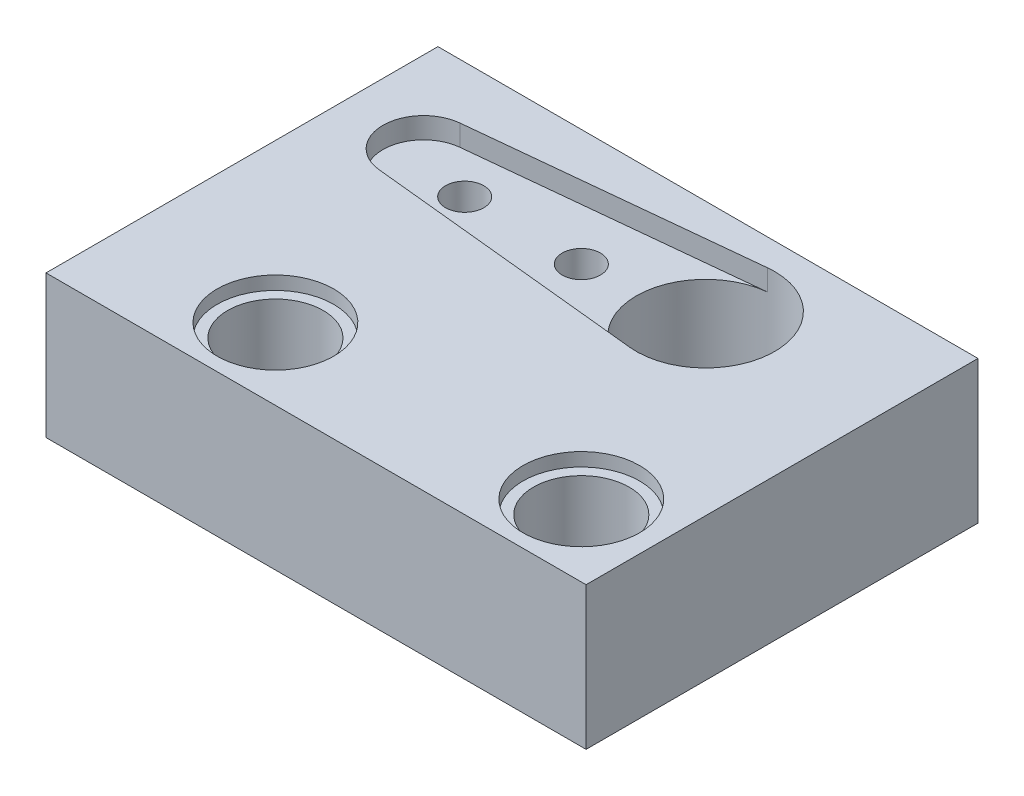
ISO-10303-21;
HEADER;
FILE_DESCRIPTION(('STEP AP214'),'2;1');
FILE_NAME('part.step','',(''),(''),'','','');
FILE_SCHEMA(('AUTOMOTIVE_DESIGN { 1 0 10303 214 1 1 1 1 }'));
ENDSEC;
DATA;
#1=APPLICATION_CONTEXT('core data for automotive mechanical design processes');
#2=APPLICATION_PROTOCOL_DEFINITION('international standard','automotive_design',2000,#1);
#3=PRODUCT_CONTEXT('',#1,'mechanical');
#4=PRODUCT('Part','Part','',(#3));
#5=PRODUCT_RELATED_PRODUCT_CATEGORY('part','',(#4));
#6=PRODUCT_DEFINITION_FORMATION('','',#4);
#7=PRODUCT_DEFINITION_CONTEXT('part definition',#1,'design');
#8=PRODUCT_DEFINITION('design','',#6,#7);
#9=PRODUCT_DEFINITION_SHAPE('','',#8);
#10=(LENGTH_UNIT() NAMED_UNIT(*) SI_UNIT(.MILLI.,.METRE.));
#11=(NAMED_UNIT(*) PLANE_ANGLE_UNIT() SI_UNIT($,.RADIAN.));
#12=(NAMED_UNIT(*) SI_UNIT($,.STERADIAN.) SOLID_ANGLE_UNIT());
#13=UNCERTAINTY_MEASURE_WITH_UNIT(LENGTH_MEASURE(1.E-05),#10,'distance_accuracy_value','');
#14=(GEOMETRIC_REPRESENTATION_CONTEXT(3) GLOBAL_UNCERTAINTY_ASSIGNED_CONTEXT((#13)) GLOBAL_UNIT_ASSIGNED_CONTEXT((#10,
#11,#12)) REPRESENTATION_CONTEXT('',''));
#15=CARTESIAN_POINT('',(0.,0.,0.));
#16=DIRECTION('',(0.,0.,1.));
#17=DIRECTION('',(1.,0.,0.));
#18=AXIS2_PLACEMENT_3D('',#15,#16,#17);
#19=CARTESIAN_POINT('',(-10.75,7.46,-19.25));
#20=DIRECTION('',(0.,-1.,0.));
#21=DIRECTION('',(0.,0.,1.));
#22=AXIS2_PLACEMENT_3D('',#19,#20,#21);
#23=CYLINDRICAL_SURFACE('',#22,2.5);
#24=CARTESIAN_POINT('',(-10.75,6.76,-19.25));
#25=DIRECTION('',(0.,-1.,0.));
#26=DIRECTION('',(0.,0.,-1.));
#27=AXIS2_PLACEMENT_3D('',#24,#25,#26);
#28=CIRCLE('',#27,2.5);
#29=CARTESIAN_POINT('',(-10.75,6.76,-16.75));
#30=VERTEX_POINT('',#29);
#31=EDGE_CURVE('E120',#30,#30,#28,.T.);
#32=CARTESIAN_POINT('',(-10.75,0.7,-19.25));
#33=DIRECTION('',(0.,1.,0.));
#34=DIRECTION('',(0.,0.,1.));
#35=AXIS2_PLACEMENT_3D('',#32,#33,#34);
#36=CIRCLE('',#35,2.5);
#37=CARTESIAN_POINT('',(-10.75,0.7,-16.75));
#38=VERTEX_POINT('',#37);
#39=EDGE_CURVE('E37',#38,#38,#36,.T.);
#40=CARTESIAN_POINT('',(-10.75,6.76,-16.75));
#41=CARTESIAN_POINT('',(-10.75,6.696875,-16.75));
#42=CARTESIAN_POINT('',(-10.75,6.63375,-16.75));
#43=CARTESIAN_POINT('',(-10.75,6.5075,-16.75));
#44=CARTESIAN_POINT('',(-10.75,6.444375,-16.75));
#45=CARTESIAN_POINT('',(-10.75,6.318125,-16.75));
#46=CARTESIAN_POINT('',(-10.75,6.255,-16.75));
#47=CARTESIAN_POINT('',(-10.75,6.12875,-16.75));
#48=CARTESIAN_POINT('',(-10.75,6.065625,-16.75));
#49=CARTESIAN_POINT('',(-10.75,5.939375,-16.75));
#50=CARTESIAN_POINT('',(-10.75,5.87625,-16.75));
#51=CARTESIAN_POINT('',(-10.75,5.75,-16.75));
#52=CARTESIAN_POINT('',(-10.75,5.686875,-16.75));
#53=CARTESIAN_POINT('',(-10.75,5.560625,-16.75));
#54=CARTESIAN_POINT('',(-10.75,5.4975,-16.75));
#55=CARTESIAN_POINT('',(-10.75,5.37125,-16.75));
#56=CARTESIAN_POINT('',(-10.75,5.308125,-16.75));
#57=CARTESIAN_POINT('',(-10.75,5.181875,-16.75));
#58=CARTESIAN_POINT('',(-10.75,5.11875,-16.75));
#59=CARTESIAN_POINT('',(-10.75,4.9925,-16.75));
#60=CARTESIAN_POINT('',(-10.75,4.929375,-16.75));
#61=CARTESIAN_POINT('',(-10.75,4.803125,-16.75));
#62=CARTESIAN_POINT('',(-10.75,4.74,-16.75));
#63=CARTESIAN_POINT('',(-10.75,4.61375,-16.75));
#64=CARTESIAN_POINT('',(-10.75,4.550625,-16.75));
#65=CARTESIAN_POINT('',(-10.75,4.424375,-16.75));
#66=CARTESIAN_POINT('',(-10.75,4.36125,-16.75));
#67=CARTESIAN_POINT('',(-10.75,4.235,-16.75));
#68=CARTESIAN_POINT('',(-10.75,4.171875,-16.75));
#69=CARTESIAN_POINT('',(-10.75,4.045625,-16.75));
#70=CARTESIAN_POINT('',(-10.75,3.9825,-16.75));
#71=CARTESIAN_POINT('',(-10.75,3.85625,-16.75));
#72=CARTESIAN_POINT('',(-10.75,3.793125,-16.75));
#73=CARTESIAN_POINT('',(-10.75,3.666875,-16.75));
#74=CARTESIAN_POINT('',(-10.75,3.60375,-16.75));
#75=CARTESIAN_POINT('',(-10.75,3.4775,-16.75));
#76=CARTESIAN_POINT('',(-10.75,3.414375,-16.75));
#77=CARTESIAN_POINT('',(-10.75,3.288125,-16.75));
#78=CARTESIAN_POINT('',(-10.75,3.225,-16.75));
#79=CARTESIAN_POINT('',(-10.75,3.09875,-16.75));
#80=CARTESIAN_POINT('',(-10.75,3.035625,-16.75));
#81=CARTESIAN_POINT('',(-10.75,2.909375,-16.75));
#82=CARTESIAN_POINT('',(-10.75,2.84625,-16.75));
#83=CARTESIAN_POINT('',(-10.75,2.72,-16.75));
#84=CARTESIAN_POINT('',(-10.75,2.656875,-16.75));
#85=CARTESIAN_POINT('',(-10.75,2.530625,-16.75));
#86=CARTESIAN_POINT('',(-10.75,2.4675,-16.75));
#87=CARTESIAN_POINT('',(-10.75,2.34125,-16.75));
#88=CARTESIAN_POINT('',(-10.75,2.278125,-16.75));
#89=CARTESIAN_POINT('',(-10.75,2.151875,-16.75));
#90=CARTESIAN_POINT('',(-10.75,2.08875,-16.75));
#91=CARTESIAN_POINT('',(-10.75,1.9625,-16.75));
#92=CARTESIAN_POINT('',(-10.75,1.899375,-16.75));
#93=CARTESIAN_POINT('',(-10.75,1.773125,-16.75));
#94=CARTESIAN_POINT('',(-10.75,1.71,-16.75));
#95=CARTESIAN_POINT('',(-10.75,1.58375,-16.75));
#96=CARTESIAN_POINT('',(-10.75,1.520625,-16.75));
#97=CARTESIAN_POINT('',(-10.75,1.394375,-16.75));
#98=CARTESIAN_POINT('',(-10.75,1.33125,-16.75));
#99=CARTESIAN_POINT('',(-10.75,1.205,-16.75));
#100=CARTESIAN_POINT('',(-10.75,1.141875,-16.75));
#101=CARTESIAN_POINT('',(-10.75,1.015625,-16.75));
#102=CARTESIAN_POINT('',(-10.75,0.9525,-16.75));
#103=CARTESIAN_POINT('',(-10.75,0.82625,-16.75));
#104=CARTESIAN_POINT('',(-10.75,0.763125,-16.75));
#105=CARTESIAN_POINT('',(-10.75,0.7,-16.75));
#106=B_SPLINE_CURVE_WITH_KNOTS('',3,(#40,#41,#42,#43,#44,#45,#46,#47,#48,#49,#50,#51,#52,#53,
#54,#55,#56,#57,#58,#59,#60,#61,#62,#63,#64,#65,#66,#67,#68,#69,#70,#71,#72,#73,#74,#75,#76,#77,
#78,#79,#80,#81,#82,#83,#84,#85,#86,#87,#88,#89,#90,#91,#92,#93,#94,#95,#96,#97,#98,#99,#100,
#101,#102,#103,#104,#105),.UNSPECIFIED.,.F.,.F.,(4,2,2,2,2,2,2,2,2,2,2,2,2,2,2,2,2,2,2,2,2,2,2,
2,2,2,2,2,2,2,2,2,4),(0.,0.189374999999999,0.37875,0.568125,0.7575,0.946875,1.13625,1.325625,
1.515,1.704375,1.89375,2.083125,2.2725,2.461875,2.65125,2.840625,3.03,3.219375,3.40875,3.598125,
3.7875,3.976875,4.16625,4.355625,4.545,4.734375,4.92375,5.113125,5.3025,5.491875,5.68125,
5.870625,6.06),.UNSPECIFIED.);
#107=EDGE_CURVE('BSEAM33',#30,#38,#106,.T.);
#108=ORIENTED_EDGE('',*,*,#31,.F.);
#109=ORIENTED_EDGE('',*,*,#39,.F.);
#110=ORIENTED_EDGE('',*,*,#107,.T.);
#111=ORIENTED_EDGE('',*,*,#107,.F.);
#112=EDGE_LOOP('',(#108,#110,#109,#111));
#113=FACE_BOUND('',#112,.T.);
#114=ADVANCED_FACE('F33',(#113),#23,.F.);
#115=CARTESIAN_POINT('',(5.25,7.46,-19.25));
#116=DIRECTION('',(0.,-1.,0.));
#117=DIRECTION('',(0.,0.,1.));
#118=AXIS2_PLACEMENT_3D('',#115,#116,#117);
#119=CYLINDRICAL_SURFACE('',#118,2.5);
#120=CARTESIAN_POINT('',(5.25,6.76,-19.25));
#121=DIRECTION('',(0.,-1.,0.));
#122=DIRECTION('',(0.,0.,-1.));
#123=AXIS2_PLACEMENT_3D('',#120,#121,#122);
#124=CIRCLE('',#123,2.5);
#125=CARTESIAN_POINT('',(5.25,6.76,-16.75));
#126=VERTEX_POINT('',#125);
#127=EDGE_CURVE('E169',#126,#126,#124,.T.);
#128=CARTESIAN_POINT('',(5.25,0.7,-19.25));
#129=DIRECTION('',(0.,1.,0.));
#130=DIRECTION('',(0.,0.,1.));
#131=AXIS2_PLACEMENT_3D('',#128,#129,#130);
#132=CIRCLE('',#131,2.5);
#133=CARTESIAN_POINT('',(5.25,0.7,-16.75));
#134=VERTEX_POINT('',#133);
#135=EDGE_CURVE('E173',#134,#134,#132,.T.);
#136=CARTESIAN_POINT('',(5.25,6.76,-16.75));
#137=CARTESIAN_POINT('',(5.25,6.696875,-16.75));
#138=CARTESIAN_POINT('',(5.25,6.63375,-16.75));
#139=CARTESIAN_POINT('',(5.25,6.5075,-16.75));
#140=CARTESIAN_POINT('',(5.25,6.444375,-16.75));
#141=CARTESIAN_POINT('',(5.25,6.318125,-16.75));
#142=CARTESIAN_POINT('',(5.25,6.255,-16.75));
#143=CARTESIAN_POINT('',(5.25,6.12875,-16.75));
#144=CARTESIAN_POINT('',(5.25,6.065625,-16.75));
#145=CARTESIAN_POINT('',(5.25,5.939375,-16.75));
#146=CARTESIAN_POINT('',(5.25,5.87625,-16.75));
#147=CARTESIAN_POINT('',(5.25,5.75,-16.75));
#148=CARTESIAN_POINT('',(5.25,5.686875,-16.75));
#149=CARTESIAN_POINT('',(5.25,5.560625,-16.75));
#150=CARTESIAN_POINT('',(5.25,5.4975,-16.75));
#151=CARTESIAN_POINT('',(5.25,5.37125,-16.75));
#152=CARTESIAN_POINT('',(5.25,5.308125,-16.75));
#153=CARTESIAN_POINT('',(5.25,5.181875,-16.75));
#154=CARTESIAN_POINT('',(5.25,5.11875,-16.75));
#155=CARTESIAN_POINT('',(5.25,4.9925,-16.75));
#156=CARTESIAN_POINT('',(5.25,4.929375,-16.75));
#157=CARTESIAN_POINT('',(5.25,4.803125,-16.75));
#158=CARTESIAN_POINT('',(5.25,4.74,-16.75));
#159=CARTESIAN_POINT('',(5.25,4.61375,-16.75));
#160=CARTESIAN_POINT('',(5.25,4.550625,-16.75));
#161=CARTESIAN_POINT('',(5.25,4.424375,-16.75));
#162=CARTESIAN_POINT('',(5.25,4.36125,-16.75));
#163=CARTESIAN_POINT('',(5.25,4.235,-16.75));
#164=CARTESIAN_POINT('',(5.25,4.171875,-16.75));
#165=CARTESIAN_POINT('',(5.25,4.045625,-16.75));
#166=CARTESIAN_POINT('',(5.25,3.9825,-16.75));
#167=CARTESIAN_POINT('',(5.25,3.85625,-16.75));
#168=CARTESIAN_POINT('',(5.25,3.793125,-16.75));
#169=CARTESIAN_POINT('',(5.25,3.666875,-16.75));
#170=CARTESIAN_POINT('',(5.25,3.60375,-16.75));
#171=CARTESIAN_POINT('',(5.25,3.4775,-16.75));
#172=CARTESIAN_POINT('',(5.25,3.414375,-16.75));
#173=CARTESIAN_POINT('',(5.25,3.288125,-16.75));
#174=CARTESIAN_POINT('',(5.25,3.225,-16.75));
#175=CARTESIAN_POINT('',(5.25,3.09875,-16.75));
#176=CARTESIAN_POINT('',(5.25,3.035625,-16.75));
#177=CARTESIAN_POINT('',(5.25,2.909375,-16.75));
#178=CARTESIAN_POINT('',(5.25,2.84625,-16.75));
#179=CARTESIAN_POINT('',(5.25,2.72,-16.75));
#180=CARTESIAN_POINT('',(5.25,2.656875,-16.75));
#181=CARTESIAN_POINT('',(5.25,2.530625,-16.75));
#182=CARTESIAN_POINT('',(5.25,2.4675,-16.75));
#183=CARTESIAN_POINT('',(5.25,2.34125,-16.75));
#184=CARTESIAN_POINT('',(5.25,2.278125,-16.75));
#185=CARTESIAN_POINT('',(5.25,2.151875,-16.75));
#186=CARTESIAN_POINT('',(5.25,2.08875,-16.75));
#187=CARTESIAN_POINT('',(5.25,1.9625,-16.75));
#188=CARTESIAN_POINT('',(5.25,1.899375,-16.75));
#189=CARTESIAN_POINT('',(5.25,1.773125,-16.75));
#190=CARTESIAN_POINT('',(5.25,1.71,-16.75));
#191=CARTESIAN_POINT('',(5.25,1.58375,-16.75));
#192=CARTESIAN_POINT('',(5.25,1.520625,-16.75));
#193=CARTESIAN_POINT('',(5.25,1.394375,-16.75));
#194=CARTESIAN_POINT('',(5.25,1.33125,-16.75));
#195=CARTESIAN_POINT('',(5.25,1.205,-16.75));
#196=CARTESIAN_POINT('',(5.25,1.141875,-16.75));
#197=CARTESIAN_POINT('',(5.25,1.015625,-16.75));
#198=CARTESIAN_POINT('',(5.25,0.9525,-16.75));
#199=CARTESIAN_POINT('',(5.25,0.82625,-16.75));
#200=CARTESIAN_POINT('',(5.25,0.763125,-16.75));
#201=CARTESIAN_POINT('',(5.25,0.7,-16.75));
#202=B_SPLINE_CURVE_WITH_KNOTS('',3,(#136,#137,#138,#139,#140,#141,#142,#143,#144,#145,#146,
#147,#148,#149,#150,#151,#152,#153,#154,#155,#156,#157,#158,#159,#160,#161,#162,#163,#164,#165,
#166,#167,#168,#169,#170,#171,#172,#173,#174,#175,#176,#177,#178,#179,#180,#181,#182,#183,#184,
#185,#186,#187,#188,#189,#190,#191,#192,#193,#194,#195,#196,#197,#198,#199,#200,#201),
.UNSPECIFIED.,.F.,.F.,(4,2,2,2,2,2,2,2,2,2,2,2,2,2,2,2,2,2,2,2,2,2,2,2,2,2,2,2,2,2,2,2,4),(0.,
0.189374999999999,0.37875,0.568125,0.7575,0.946875,1.13625,1.325625,1.515,1.704375,1.89375,
2.083125,2.2725,2.461875,2.65125,2.840625,3.03,3.219375,3.40875,3.598125,3.7875,3.976875,
4.16625,4.355625,4.545,4.734375,4.92375,5.113125,5.3025,5.491875,5.68125,5.870625,6.06),.UNSPECIFIED.);
#203=EDGE_CURVE('BSEAM238',#126,#134,#202,.T.);
#204=ORIENTED_EDGE('',*,*,#127,.F.);
#205=ORIENTED_EDGE('',*,*,#135,.F.);
#206=ORIENTED_EDGE('',*,*,#203,.T.);
#207=ORIENTED_EDGE('',*,*,#203,.F.);
#208=EDGE_LOOP('',(#204,#206,#205,#207));
#209=FACE_BOUND('',#208,.T.);
#210=ADVANCED_FACE('F238',(#209),#119,.F.);
#211=CARTESIAN_POINT('',(0.,7.46,-31.));
#212=DIRECTION('',(0.,1.,0.));
#213=DIRECTION('',(0.,0.,-1.));
#214=AXIS2_PLACEMENT_3D('',#211,#212,#213);
#215=PLANE('',#214);
#216=CARTESIAN_POINT('',(5.25,7.46,-19.25));
#217=DIRECTION('',(0.,-1.,0.));
#218=DIRECTION('',(0.,0.,-1.));
#219=AXIS2_PLACEMENT_3D('',#216,#217,#218);
#220=CIRCLE('',#219,3.05);
#221=CARTESIAN_POINT('',(5.25,7.46,-22.3));
#222=VERTEX_POINT('',#221);
#223=EDGE_CURVE('E175',#222,#222,#220,.T.);
#224=ORIENTED_EDGE('',*,*,#223,.T.);
#225=EDGE_LOOP('',(#224));
#226=FACE_BOUND('',#225,.T.);
#227=CARTESIAN_POINT('',(-10.75,7.46,-19.25));
#228=DIRECTION('',(0.,-1.,0.));
#229=DIRECTION('',(0.,0.,-1.));
#230=AXIS2_PLACEMENT_3D('',#227,#228,#229);
#231=CIRCLE('',#230,3.05);
#232=CARTESIAN_POINT('',(-10.75,7.46,-22.3));
#233=VERTEX_POINT('',#232);
#234=EDGE_CURVE('E171',#233,#233,#231,.T.);
#235=ORIENTED_EDGE('',*,*,#234,.T.);
#236=EDGE_LOOP('',(#235));
#237=FACE_BOUND('',#236,.T.);
#238=CARTESIAN_POINT('',(-14.75,7.46,-31.));
#239=DIRECTION('',(0.,-1.,0.));
#240=DIRECTION('',(0.,0.,-1.));
#241=AXIS2_PLACEMENT_3D('',#238,#239,#240);
#242=CIRCLE('',#241,2.125);
#243=CARTESIAN_POINT('',(-14.9654595343537,7.46,-28.8859512330469));
#244=VERTEX_POINT('',#243);
#245=CARTESIAN_POINT('',(-14.9654595343537,7.46,-33.1140487669531));
#246=VERTEX_POINT('',#245);
#247=EDGE_CURVE('E210',#244,#246,#242,.T.);
#248=ORIENTED_EDGE('',*,*,#247,.T.);
#249=DIRECTION('',(0.994846478566184,0.,-0.101392722048793));
#250=VECTOR('',#249,1.);
#251=CARTESIAN_POINT('',(-14.9654595343537,7.46,-33.1140487669531));
#252=LINE('',#251,#250);
#253=CARTESIAN_POINT('',(-0.367096674599527,7.46,-34.6018841060697));
#254=VERTEX_POINT('',#253);
#255=EDGE_CURVE('E217',#246,#254,#252,.T.);
#256=ORIENTED_EDGE('',*,*,#255,.T.);
#257=CARTESIAN_POINT('',(0.,7.46,-31.));
#258=DIRECTION('',(0.,-1.,0.));
#259=DIRECTION('',(0.,0.,-1.));
#260=AXIS2_PLACEMENT_3D('',#257,#258,#259);
#261=CIRCLE('',#260,3.62054265021969);
#262=CARTESIAN_POINT('',(-0.367096674599527,7.46,-27.3981158939303));
#263=VERTEX_POINT('',#262);
#264=EDGE_CURVE('E220',#254,#263,#261,.T.);
#265=ORIENTED_EDGE('',*,*,#264,.T.);
#266=DIRECTION('',(-0.994846478566184,0.,-0.101392722048792));
#267=VECTOR('',#266,1.);
#268=CARTESIAN_POINT('',(-14.9654595343537,7.46,-28.8859512330469));
#269=LINE('',#268,#267);
#270=EDGE_CURVE('E133',#263,#244,#269,.T.);
#271=ORIENTED_EDGE('',*,*,#270,.T.);
#272=EDGE_LOOP('',(#248,#256,#265,#271));
#273=FACE_BOUND('',#272,.T.);
#274=DIRECTION('',(0.,0.,1.));
#275=VECTOR('',#274,1.);
#276=CARTESIAN_POINT('',(9.25,7.46,-15.5));
#277=LINE('',#276,#275);
#278=CARTESIAN_POINT('',(9.25,7.46,-36.));
#279=VERTEX_POINT('',#278);
#280=CARTESIAN_POINT('',(9.25,7.46,-15.5));
#281=VERTEX_POINT('',#280);
#282=EDGE_CURVE('E143',#279,#281,#277,.T.);
#283=ORIENTED_EDGE('',*,*,#282,.F.);
#284=DIRECTION('',(1.,0.,0.));
#285=VECTOR('',#284,1.);
#286=CARTESIAN_POINT('',(-19.,7.46,-36.));
#287=LINE('',#286,#285);
#288=CARTESIAN_POINT('',(-19.,7.46,-36.));
#289=VERTEX_POINT('',#288);
#290=EDGE_CURVE('E151',#289,#279,#287,.T.);
#291=ORIENTED_EDGE('',*,*,#290,.F.);
#292=DIRECTION('',(0.,0.,-1.));
#293=VECTOR('',#292,1.);
#294=CARTESIAN_POINT('',(-19.,7.46,-15.5));
#295=LINE('',#294,#293);
#296=CARTESIAN_POINT('',(-19.,7.46,-15.5));
#297=VERTEX_POINT('',#296);
#298=EDGE_CURVE('E148',#297,#289,#295,.T.);
#299=ORIENTED_EDGE('',*,*,#298,.F.);
#300=DIRECTION('',(-1.,0.,0.));
#301=VECTOR('',#300,1.);
#302=CARTESIAN_POINT('',(9.25,7.46,-15.5));
#303=LINE('',#302,#301);
#304=EDGE_CURVE('E145',#281,#297,#303,.T.);
#305=ORIENTED_EDGE('',*,*,#304,.F.);
#306=EDGE_LOOP('',(#283,#291,#299,#305));
#307=FACE_BOUND('',#306,.T.);
#308=ADVANCED_FACE('F222',(#226,#237,#273,#307),#215,.T.);
#309=CARTESIAN_POINT('',(0.,0.,-31.));
#310=DIRECTION('',(0.,1.,0.));
#311=DIRECTION('',(0.,0.,-1.));
#312=AXIS2_PLACEMENT_3D('',#309,#310,#311);
#313=PLANE('',#312);
#314=CARTESIAN_POINT('',(-10.75,0.,-19.25));
#315=DIRECTION('',(0.,1.,0.));
#316=DIRECTION('',(0.,0.,1.));
#317=AXIS2_PLACEMENT_3D('',#314,#315,#316);
#318=CIRCLE('',#317,3.05);
#319=CARTESIAN_POINT('',(-10.75,0.,-16.2));
#320=VERTEX_POINT('',#319);
#321=EDGE_CURVE('E189',#320,#320,#318,.T.);
#322=ORIENTED_EDGE('',*,*,#321,.T.);
#323=EDGE_LOOP('',(#322));
#324=FACE_BOUND('',#323,.T.);
#325=CARTESIAN_POINT('',(5.25,0.,-19.25));
#326=DIRECTION('',(0.,1.,0.));
#327=DIRECTION('',(0.,0.,1.));
#328=AXIS2_PLACEMENT_3D('',#325,#326,#327);
#329=CIRCLE('',#328,3.05);
#330=CARTESIAN_POINT('',(5.25,0.,-16.2));
#331=VERTEX_POINT('',#330);
#332=EDGE_CURVE('E182',#331,#331,#329,.T.);
#333=ORIENTED_EDGE('',*,*,#332,.T.);
#334=EDGE_LOOP('',(#333));
#335=FACE_BOUND('',#334,.T.);
#336=CARTESIAN_POINT('',(-6.5,0.,-31.));
#337=DIRECTION('',(0.,-1.,0.));
#338=DIRECTION('',(0.,0.,-1.));
#339=AXIS2_PLACEMENT_3D('',#336,#337,#338);
#340=CIRCLE('',#339,1.);
#341=CARTESIAN_POINT('',(-6.5,0.,-32.));
#342=VERTEX_POINT('',#341);
#343=EDGE_CURVE('E198',#342,#342,#340,.T.);
#344=ORIENTED_EDGE('',*,*,#343,.F.);
#345=EDGE_LOOP('',(#344));
#346=FACE_BOUND('',#345,.T.);
#347=CARTESIAN_POINT('',(0.,0.,-31.));
#348=DIRECTION('',(0.,-1.,0.));
#349=DIRECTION('',(0.,0.,-1.));
#350=AXIS2_PLACEMENT_3D('',#347,#348,#349);
#351=CIRCLE('',#350,3.62054265021969);
#352=CARTESIAN_POINT('',(0.,0.,-34.6205426502197));
#353=VERTEX_POINT('',#352);
#354=EDGE_CURVE('E119',#353,#353,#351,.T.);
#355=ORIENTED_EDGE('',*,*,#354,.F.);
#356=EDGE_LOOP('',(#355));
#357=FACE_BOUND('',#356,.T.);
#358=CARTESIAN_POINT('',(-12.6,0.,-31.));
#359=DIRECTION('',(0.,-1.,0.));
#360=DIRECTION('',(0.,0.,-1.));
#361=AXIS2_PLACEMENT_3D('',#358,#359,#360);
#362=CIRCLE('',#361,1.);
#363=CARTESIAN_POINT('',(-12.6,0.,-32.));
#364=VERTEX_POINT('',#363);
#365=EDGE_CURVE('E207',#364,#364,#362,.T.);
#366=ORIENTED_EDGE('',*,*,#365,.F.);
#367=EDGE_LOOP('',(#366));
#368=FACE_BOUND('',#367,.T.);
#369=DIRECTION('',(0.,0.,1.));
#370=VECTOR('',#369,1.);
#371=CARTESIAN_POINT('',(9.25,0.,-15.5));
#372=LINE('',#371,#370);
#373=CARTESIAN_POINT('',(9.25,0.,-36.));
#374=VERTEX_POINT('',#373);
#375=CARTESIAN_POINT('',(9.25,0.,-15.5));
#376=VERTEX_POINT('',#375);
#377=EDGE_CURVE('E137',#374,#376,#372,.T.);
#378=ORIENTED_EDGE('',*,*,#377,.T.);
#379=DIRECTION('',(-1.,0.,0.));
#380=VECTOR('',#379,1.);
#381=CARTESIAN_POINT('',(9.25,0.,-15.5));
#382=LINE('',#381,#380);
#383=CARTESIAN_POINT('',(-19.,0.,-15.5));
#384=VERTEX_POINT('',#383);
#385=EDGE_CURVE('E155',#376,#384,#382,.T.);
#386=ORIENTED_EDGE('',*,*,#385,.T.);
#387=DIRECTION('',(0.,0.,-1.));
#388=VECTOR('',#387,1.);
#389=CARTESIAN_POINT('',(-19.,0.,-15.5));
#390=LINE('',#389,#388);
#391=CARTESIAN_POINT('',(-19.,0.,-36.));
#392=VERTEX_POINT('',#391);
#393=EDGE_CURVE('E158',#384,#392,#390,.T.);
#394=ORIENTED_EDGE('',*,*,#393,.T.);
#395=DIRECTION('',(1.,0.,0.));
#396=VECTOR('',#395,1.);
#397=CARTESIAN_POINT('',(-19.,0.,-36.));
#398=LINE('',#397,#396);
#399=EDGE_CURVE('E146',#392,#374,#398,.T.);
#400=ORIENTED_EDGE('',*,*,#399,.T.);
#401=EDGE_LOOP('',(#378,#386,#394,#400));
#402=FACE_BOUND('',#401,.T.);
#403=ADVANCED_FACE('F250',(#324,#335,#346,#357,#368,#402),#313,.F.);
#404=CARTESIAN_POINT('',(9.25,7.46,-15.5));
#405=DIRECTION('',(-1.,0.,0.));
#406=DIRECTION('',(0.,0.,-1.));
#407=AXIS2_PLACEMENT_3D('',#404,#405,#406);
#408=PLANE('',#407);
#409=ORIENTED_EDGE('',*,*,#377,.F.);
#410=DIRECTION('',(0.,-1.,0.));
#411=VECTOR('',#410,1.);
#412=CARTESIAN_POINT('',(9.25,7.46,-36.));
#413=LINE('',#412,#411);
#414=EDGE_CURVE('E59',#279,#374,#413,.T.);
#415=ORIENTED_EDGE('',*,*,#414,.F.);
#416=ORIENTED_EDGE('',*,*,#282,.T.);
#417=DIRECTION('',(0.,-1.,0.));
#418=VECTOR('',#417,1.);
#419=CARTESIAN_POINT('',(9.25,7.46,-15.5));
#420=LINE('',#419,#418);
#421=EDGE_CURVE('E11',#281,#376,#420,.T.);
#422=ORIENTED_EDGE('',*,*,#421,.T.);
#423=EDGE_LOOP('',(#409,#415,#416,#422));
#424=FACE_BOUND('',#423,.T.);
#425=ADVANCED_FACE('F35',(#424),#408,.F.);
#426=CARTESIAN_POINT('',(9.25,7.46,-15.5));
#427=DIRECTION('',(0.,0.,-1.));
#428=DIRECTION('',(1.,0.,0.));
#429=AXIS2_PLACEMENT_3D('',#426,#427,#428);
#430=PLANE('',#429);
#431=ORIENTED_EDGE('',*,*,#385,.F.);
#432=ORIENTED_EDGE('',*,*,#421,.F.);
#433=ORIENTED_EDGE('',*,*,#304,.T.);
#434=DIRECTION('',(0.,-1.,0.));
#435=VECTOR('',#434,1.);
#436=CARTESIAN_POINT('',(-19.,7.46,-15.5));
#437=LINE('',#436,#435);
#438=EDGE_CURVE('E42',#297,#384,#437,.T.);
#439=ORIENTED_EDGE('',*,*,#438,.T.);
#440=EDGE_LOOP('',(#431,#432,#433,#439));
#441=FACE_BOUND('',#440,.T.);
#442=ADVANCED_FACE('F256',(#441),#430,.F.);
#443=CARTESIAN_POINT('',(-19.,7.46,-15.5));
#444=DIRECTION('',(1.,0.,0.));
#445=DIRECTION('',(0.,0.,1.));
#446=AXIS2_PLACEMENT_3D('',#443,#444,#445);
#447=PLANE('',#446);
#448=ORIENTED_EDGE('',*,*,#393,.F.);
#449=ORIENTED_EDGE('',*,*,#438,.F.);
#450=ORIENTED_EDGE('',*,*,#298,.T.);
#451=DIRECTION('',(0.,-1.,0.));
#452=VECTOR('',#451,1.);
#453=CARTESIAN_POINT('',(-19.,7.46,-36.));
#454=LINE('',#453,#452);
#455=EDGE_CURVE('E163',#289,#392,#454,.T.);
#456=ORIENTED_EDGE('',*,*,#455,.T.);
#457=EDGE_LOOP('',(#448,#449,#450,#456));
#458=FACE_BOUND('',#457,.T.);
#459=ADVANCED_FACE('F233',(#458),#447,.F.);
#460=CARTESIAN_POINT('',(-19.,7.46,-36.));
#461=DIRECTION('',(0.,0.,1.));
#462=DIRECTION('',(-1.,0.,0.));
#463=AXIS2_PLACEMENT_3D('',#460,#461,#462);
#464=PLANE('',#463);
#465=ORIENTED_EDGE('',*,*,#399,.F.);
#466=ORIENTED_EDGE('',*,*,#455,.F.);
#467=ORIENTED_EDGE('',*,*,#290,.T.);
#468=ORIENTED_EDGE('',*,*,#414,.T.);
#469=EDGE_LOOP('',(#465,#466,#467,#468));
#470=FACE_BOUND('',#469,.T.);
#471=ADVANCED_FACE('F226',(#470),#464,.F.);
#472=CARTESIAN_POINT('',(-14.75,6.36,-31.));
#473=DIRECTION('',(0.,1.,0.));
#474=DIRECTION('',(0.,0.,-1.));
#475=AXIS2_PLACEMENT_3D('',#472,#473,#474);
#476=CYLINDRICAL_SURFACE('',#475,2.125);
#477=ORIENTED_EDGE('',*,*,#247,.F.);
#478=DIRECTION('',(0.,1.,0.));
#479=VECTOR('',#478,1.);
#480=CARTESIAN_POINT('',(-14.9654595343537,6.36,-28.8859512330469));
#481=LINE('',#480,#479);
#482=CARTESIAN_POINT('',(-14.9654595343537,6.36,-28.8859512330469));
#483=VERTEX_POINT('',#482);
#484=EDGE_CURVE('E135',#483,#244,#481,.T.);
#485=ORIENTED_EDGE('',*,*,#484,.F.);
#486=CARTESIAN_POINT('',(-14.75,6.36,-31.));
#487=DIRECTION('',(0.,-1.,0.));
#488=DIRECTION('',(0.,0.,-1.));
#489=AXIS2_PLACEMENT_3D('',#486,#487,#488);
#490=CIRCLE('',#489,2.125);
#491=CARTESIAN_POINT('',(-14.9654595343537,6.36,-33.1140487669531));
#492=VERTEX_POINT('',#491);
#493=EDGE_CURVE('E126',#483,#492,#490,.T.);
#494=ORIENTED_EDGE('',*,*,#493,.T.);
#495=DIRECTION('',(0.,1.,0.));
#496=VECTOR('',#495,1.);
#497=CARTESIAN_POINT('',(-14.9654595343537,6.36,-33.1140487669531));
#498=LINE('',#497,#496);
#499=EDGE_CURVE('E50',#492,#246,#498,.T.);
#500=ORIENTED_EDGE('',*,*,#499,.T.);
#501=EDGE_LOOP('',(#477,#485,#494,#500));
#502=FACE_BOUND('',#501,.T.);
#503=ADVANCED_FACE('F224',(#502),#476,.F.);
#504=CARTESIAN_POINT('',(-14.9654595343537,6.36,-28.8859512330469));
#505=DIRECTION('',(-0.101392722048792,0.,0.994846478566184));
#506=DIRECTION('',(-0.994846478566184,0.,-0.101392722048792));
#507=AXIS2_PLACEMENT_3D('',#504,#505,#506);
#508=PLANE('',#507);
#509=ORIENTED_EDGE('',*,*,#270,.F.);
#510=DIRECTION('',(0.,1.,0.));
#511=VECTOR('',#510,1.);
#512=CARTESIAN_POINT('',(-0.367096674599527,6.36,-27.3981158939303));
#513=LINE('',#512,#511);
#514=CARTESIAN_POINT('',(-0.367096674599527,6.36,-27.3981158939303));
#515=VERTEX_POINT('',#514);
#516=EDGE_CURVE('E115',#515,#263,#513,.T.);
#517=ORIENTED_EDGE('',*,*,#516,.F.);
#518=DIRECTION('',(-0.994846478566184,0.,-0.101392722048792));
#519=VECTOR('',#518,1.);
#520=CARTESIAN_POINT('',(-14.9654595343537,6.36,-28.8859512330469));
#521=LINE('',#520,#519);
#522=EDGE_CURVE('E123',#515,#483,#521,.T.);
#523=ORIENTED_EDGE('',*,*,#522,.T.);
#524=ORIENTED_EDGE('',*,*,#484,.T.);
#525=EDGE_LOOP('',(#509,#517,#523,#524));
#526=FACE_BOUND('',#525,.T.);
#527=ADVANCED_FACE('F131',(#526),#508,.F.);
#528=CARTESIAN_POINT('',(0.,6.36,-31.));
#529=DIRECTION('',(0.,1.,0.));
#530=DIRECTION('',(0.,0.,-1.));
#531=AXIS2_PLACEMENT_3D('',#528,#529,#530);
#532=CYLINDRICAL_SURFACE('',#531,3.62054265021969);
#533=ORIENTED_EDGE('',*,*,#264,.F.);
#534=DIRECTION('',(0.,1.,0.));
#535=VECTOR('',#534,1.);
#536=CARTESIAN_POINT('',(-0.367096674599527,6.36,-34.6018841060697));
#537=LINE('',#536,#535);
#538=CARTESIAN_POINT('',(-0.367096674599527,6.36,-34.6018841060697));
#539=VERTEX_POINT('',#538);
#540=EDGE_CURVE('E117',#539,#254,#537,.T.);
#541=ORIENTED_EDGE('',*,*,#540,.F.);
#542=CARTESIAN_POINT('',(0.,6.36,-31.));
#543=DIRECTION('',(0.,-1.,0.));
#544=DIRECTION('',(0.,0.,-1.));
#545=AXIS2_PLACEMENT_3D('',#542,#543,#544);
#546=CIRCLE('',#545,3.62054265021969);
#547=EDGE_CURVE('E109',#515,#539,#546,.T.);
#548=ORIENTED_EDGE('',*,*,#547,.F.);
#549=ORIENTED_EDGE('',*,*,#516,.T.);
#550=EDGE_LOOP('',(#533,#541,#548,#549));
#551=FACE_BOUND('',#550,.T.);
#552=ORIENTED_EDGE('',*,*,#354,.T.);
#553=EDGE_LOOP('',(#552));
#554=FACE_BOUND('',#553,.T.);
#555=ADVANCED_FACE('F112',(#551,#554),#532,.F.);
#556=CARTESIAN_POINT('',(-14.9654595343537,6.36,-33.1140487669531));
#557=DIRECTION('',(-0.101392722048793,0.,-0.994846478566184));
#558=DIRECTION('',(0.994846478566184,0.,-0.101392722048793));
#559=AXIS2_PLACEMENT_3D('',#556,#557,#558);
#560=PLANE('',#559);
#561=ORIENTED_EDGE('',*,*,#255,.F.);
#562=ORIENTED_EDGE('',*,*,#499,.F.);
#563=DIRECTION('',(0.994846478566184,0.,-0.101392722048793));
#564=VECTOR('',#563,1.);
#565=CARTESIAN_POINT('',(-14.9654595343537,6.36,-33.1140487669531));
#566=LINE('',#565,#564);
#567=EDGE_CURVE('E129',#492,#539,#566,.T.);
#568=ORIENTED_EDGE('',*,*,#567,.T.);
#569=ORIENTED_EDGE('',*,*,#540,.T.);
#570=EDGE_LOOP('',(#561,#562,#568,#569));
#571=FACE_BOUND('',#570,.T.);
#572=ADVANCED_FACE('F324',(#571),#560,.F.);
#573=CARTESIAN_POINT('',(-14.75,6.36,-31.));
#574=DIRECTION('',(0.,1.,0.));
#575=DIRECTION('',(0.,0.,-1.));
#576=AXIS2_PLACEMENT_3D('',#573,#574,#575);
#577=PLANE('',#576);
#578=CARTESIAN_POINT('',(-6.5,6.36,-31.));
#579=DIRECTION('',(0.,-1.,0.));
#580=DIRECTION('',(0.,0.,-1.));
#581=AXIS2_PLACEMENT_3D('',#578,#579,#580);
#582=CIRCLE('',#581,1.);
#583=CARTESIAN_POINT('',(-6.5,6.36,-32.));
#584=VERTEX_POINT('',#583);
#585=EDGE_CURVE('E202',#584,#584,#582,.T.);
#586=ORIENTED_EDGE('',*,*,#585,.T.);
#587=EDGE_LOOP('',(#586));
#588=FACE_BOUND('',#587,.T.);
#589=ORIENTED_EDGE('',*,*,#547,.T.);
#590=ORIENTED_EDGE('',*,*,#567,.F.);
#591=ORIENTED_EDGE('',*,*,#493,.F.);
#592=ORIENTED_EDGE('',*,*,#522,.F.);
#593=EDGE_LOOP('',(#589,#590,#591,#592));
#594=FACE_BOUND('',#593,.T.);
#595=CARTESIAN_POINT('',(-12.6,6.36,-31.));
#596=DIRECTION('',(0.,-1.,0.));
#597=DIRECTION('',(0.,0.,-1.));
#598=AXIS2_PLACEMENT_3D('',#595,#596,#597);
#599=CIRCLE('',#598,1.);
#600=CARTESIAN_POINT('',(-12.6,6.36,-32.));
#601=VERTEX_POINT('',#600);
#602=EDGE_CURVE('E201',#601,#601,#599,.T.);
#603=ORIENTED_EDGE('',*,*,#602,.T.);
#604=EDGE_LOOP('',(#603));
#605=FACE_BOUND('',#604,.T.);
#606=ADVANCED_FACE('F124',(#588,#594,#605),#577,.T.);
#607=CARTESIAN_POINT('',(-12.6,0.,-31.));
#608=DIRECTION('',(0.,1.,0.));
#609=DIRECTION('',(0.,0.,-1.));
#610=AXIS2_PLACEMENT_3D('',#607,#608,#609);
#611=CYLINDRICAL_SURFACE('',#610,1.);
#612=ORIENTED_EDGE('',*,*,#365,.T.);
#613=EDGE_LOOP('',(#612));
#614=FACE_BOUND('',#613,.T.);
#615=ORIENTED_EDGE('',*,*,#602,.F.);
#616=EDGE_LOOP('',(#615));
#617=FACE_BOUND('',#616,.T.);
#618=ADVANCED_FACE('F342',(#614,#617),#611,.F.);
#619=CARTESIAN_POINT('',(-6.5,0.,-31.));
#620=DIRECTION('',(0.,1.,0.));
#621=DIRECTION('',(0.,0.,-1.));
#622=AXIS2_PLACEMENT_3D('',#619,#620,#621);
#623=CYLINDRICAL_SURFACE('',#622,1.);
#624=ORIENTED_EDGE('',*,*,#343,.T.);
#625=EDGE_LOOP('',(#624));
#626=FACE_BOUND('',#625,.T.);
#627=ORIENTED_EDGE('',*,*,#585,.F.);
#628=EDGE_LOOP('',(#627));
#629=FACE_BOUND('',#628,.T.);
#630=ADVANCED_FACE('F351',(#626,#629),#623,.F.);
#631=CARTESIAN_POINT('',(-10.75,6.76,-19.25));
#632=DIRECTION('',(0.,1.,0.));
#633=DIRECTION('',(0.,0.,-1.));
#634=AXIS2_PLACEMENT_3D('',#631,#632,#633);
#635=CYLINDRICAL_SURFACE('',#634,3.05);
#636=CARTESIAN_POINT('',(-10.75,6.76,-19.25));
#637=DIRECTION('',(0.,-1.,0.));
#638=DIRECTION('',(0.,0.,-1.));
#639=AXIS2_PLACEMENT_3D('',#636,#637,#638);
#640=CIRCLE('',#639,3.05);
#641=CARTESIAN_POINT('',(-10.75,6.76,-22.3));
#642=VERTEX_POINT('',#641);
#643=EDGE_CURVE('E168',#642,#642,#640,.T.);
#644=ORIENTED_EDGE('',*,*,#643,.T.);
#645=EDGE_LOOP('',(#644));
#646=FACE_BOUND('',#645,.T.);
#647=ORIENTED_EDGE('',*,*,#234,.F.);
#648=EDGE_LOOP('',(#647));
#649=FACE_BOUND('',#648,.T.);
#650=ADVANCED_FACE('F360',(#646,#649),#635,.F.);
#651=CARTESIAN_POINT('',(-10.75,6.76,-19.25));
#652=DIRECTION('',(0.,1.,0.));
#653=DIRECTION('',(0.,0.,-1.));
#654=AXIS2_PLACEMENT_3D('',#651,#652,#653);
#655=PLANE('',#654);
#656=ORIENTED_EDGE('',*,*,#31,.T.);
#657=EDGE_LOOP('',(#656));
#658=FACE_BOUND('',#657,.T.);
#659=ORIENTED_EDGE('',*,*,#643,.F.);
#660=EDGE_LOOP('',(#659));
#661=FACE_BOUND('',#660,.T.);
#662=ADVANCED_FACE('F369',(#658,#661),#655,.T.);
#663=CARTESIAN_POINT('',(5.25,6.76,-19.25));
#664=DIRECTION('',(0.,1.,0.));
#665=DIRECTION('',(0.,0.,-1.));
#666=AXIS2_PLACEMENT_3D('',#663,#664,#665);
#667=CYLINDRICAL_SURFACE('',#666,3.05);
#668=CARTESIAN_POINT('',(5.25,6.76,-19.25));
#669=DIRECTION('',(0.,-1.,0.));
#670=DIRECTION('',(0.,0.,-1.));
#671=AXIS2_PLACEMENT_3D('',#668,#669,#670);
#672=CIRCLE('',#671,3.05);
#673=CARTESIAN_POINT('',(5.25,6.76,-22.3));
#674=VERTEX_POINT('',#673);
#675=EDGE_CURVE('E172',#674,#674,#672,.T.);
#676=ORIENTED_EDGE('',*,*,#675,.T.);
#677=EDGE_LOOP('',(#676));
#678=FACE_BOUND('',#677,.T.);
#679=ORIENTED_EDGE('',*,*,#223,.F.);
#680=EDGE_LOOP('',(#679));
#681=FACE_BOUND('',#680,.T.);
#682=ADVANCED_FACE('F378',(#678,#681),#667,.F.);
#683=CARTESIAN_POINT('',(5.25,6.76,-19.25));
#684=DIRECTION('',(0.,1.,0.));
#685=DIRECTION('',(0.,0.,-1.));
#686=AXIS2_PLACEMENT_3D('',#683,#684,#685);
#687=PLANE('',#686);
#688=ORIENTED_EDGE('',*,*,#127,.T.);
#689=EDGE_LOOP('',(#688));
#690=FACE_BOUND('',#689,.T.);
#691=ORIENTED_EDGE('',*,*,#675,.F.);
#692=EDGE_LOOP('',(#691));
#693=FACE_BOUND('',#692,.T.);
#694=ADVANCED_FACE('F387',(#690,#693),#687,.T.);
#695=CARTESIAN_POINT('',(5.25,0.7,-19.25));
#696=DIRECTION('',(0.,-1.,0.));
#697=DIRECTION('',(0.,0.,1.));
#698=AXIS2_PLACEMENT_3D('',#695,#696,#697);
#699=CYLINDRICAL_SURFACE('',#698,3.05);
#700=CARTESIAN_POINT('',(5.25,0.7,-19.25));
#701=DIRECTION('',(0.,1.,0.));
#702=DIRECTION('',(0.,0.,1.));
#703=AXIS2_PLACEMENT_3D('',#700,#701,#702);
#704=CIRCLE('',#703,3.05);
#705=CARTESIAN_POINT('',(5.25,0.7,-16.2));
#706=VERTEX_POINT('',#705);
#707=EDGE_CURVE('E176',#706,#706,#704,.T.);
#708=ORIENTED_EDGE('',*,*,#707,.T.);
#709=EDGE_LOOP('',(#708));
#710=FACE_BOUND('',#709,.T.);
#711=ORIENTED_EDGE('',*,*,#332,.F.);
#712=EDGE_LOOP('',(#711));
#713=FACE_BOUND('',#712,.T.);
#714=ADVANCED_FACE('F396',(#710,#713),#699,.F.);
#715=CARTESIAN_POINT('',(5.25,0.7,-19.25));
#716=DIRECTION('',(0.,-1.,0.));
#717=DIRECTION('',(0.,0.,1.));
#718=AXIS2_PLACEMENT_3D('',#715,#716,#717);
#719=PLANE('',#718);
#720=ORIENTED_EDGE('',*,*,#135,.T.);
#721=EDGE_LOOP('',(#720));
#722=FACE_BOUND('',#721,.T.);
#723=ORIENTED_EDGE('',*,*,#707,.F.);
#724=EDGE_LOOP('',(#723));
#725=FACE_BOUND('',#724,.T.);
#726=ADVANCED_FACE('F405',(#722,#725),#719,.T.);
#727=CARTESIAN_POINT('',(-10.75,0.7,-19.25));
#728=DIRECTION('',(0.,-1.,0.));
#729=DIRECTION('',(0.,0.,1.));
#730=AXIS2_PLACEMENT_3D('',#727,#728,#729);
#731=CYLINDRICAL_SURFACE('',#730,3.05);
#732=CARTESIAN_POINT('',(-10.75,0.7,-19.25));
#733=DIRECTION('',(0.,1.,0.));
#734=DIRECTION('',(0.,0.,1.));
#735=AXIS2_PLACEMENT_3D('',#732,#733,#734);
#736=CIRCLE('',#735,3.05);
#737=CARTESIAN_POINT('',(-10.75,0.7,-16.2));
#738=VERTEX_POINT('',#737);
#739=EDGE_CURVE('E451',#738,#738,#736,.T.);
#740=ORIENTED_EDGE('',*,*,#739,.T.);
#741=EDGE_LOOP('',(#740));
#742=FACE_BOUND('',#741,.T.);
#743=ORIENTED_EDGE('',*,*,#321,.F.);
#744=EDGE_LOOP('',(#743));
#745=FACE_BOUND('',#744,.T.);
#746=ADVANCED_FACE('F413',(#742,#745),#731,.F.);
#747=CARTESIAN_POINT('',(-10.75,0.7,-19.25));
#748=DIRECTION('',(0.,-1.,0.));
#749=DIRECTION('',(0.,0.,1.));
#750=AXIS2_PLACEMENT_3D('',#747,#748,#749);
#751=PLANE('',#750);
#752=ORIENTED_EDGE('',*,*,#39,.T.);
#753=EDGE_LOOP('',(#752));
#754=FACE_BOUND('',#753,.T.);
#755=ORIENTED_EDGE('',*,*,#739,.F.);
#756=EDGE_LOOP('',(#755));
#757=FACE_BOUND('',#756,.T.);
#758=ADVANCED_FACE('F421',(#754,#757),#751,.T.);
#759=CLOSED_SHELL('',(#114,#210,#308,#403,#425,#442,#459,#471,#503,#527,#555,#572,#606,#618,
#630,#650,#662,#682,#694,#714,#726,#746,#758));
#760=MANIFOLD_SOLID_BREP('B2',#759);
#761=ADVANCED_BREP_SHAPE_REPRESENTATION('',(#18,#760),#14);
#762=SHAPE_DEFINITION_REPRESENTATION(#9,#761);
ENDSEC;
END-ISO-10303-21;
